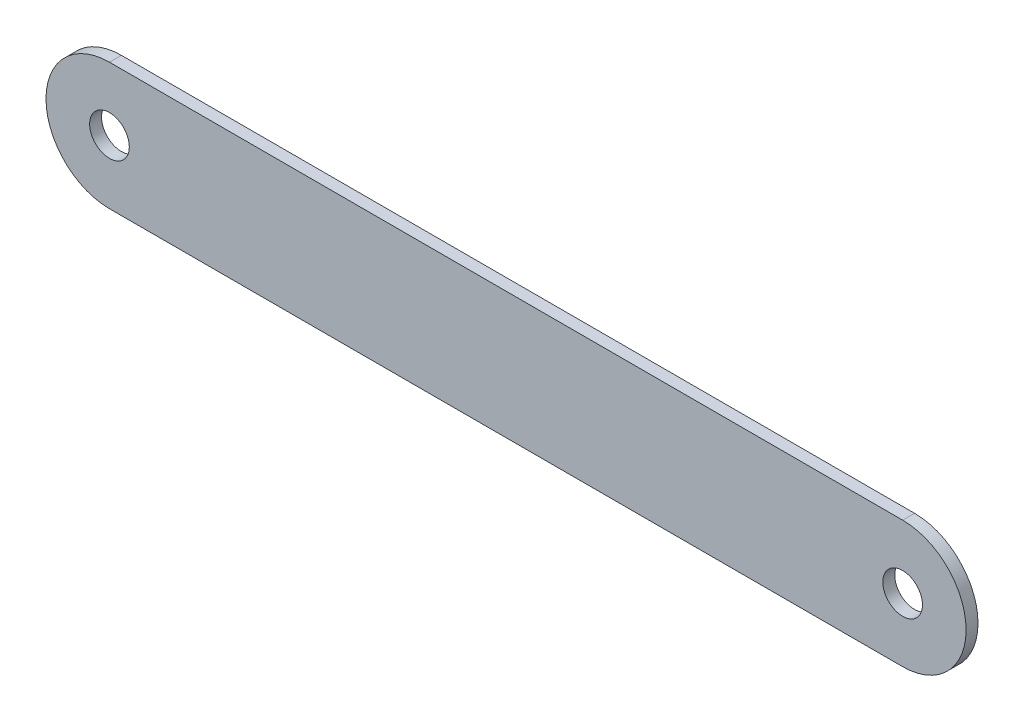
ISO-10303-21;
HEADER;
FILE_DESCRIPTION(('STEP AP214'),'2;1');
FILE_NAME('part.step','',(''),(''),'','','');
FILE_SCHEMA(('AUTOMOTIVE_DESIGN { 1 0 10303 214 1 1 1 1 }'));
ENDSEC;
DATA;
#1=APPLICATION_CONTEXT('core data for automotive mechanical design processes');
#2=APPLICATION_PROTOCOL_DEFINITION('international standard','automotive_design',2000,#1);
#3=PRODUCT_CONTEXT('',#1,'mechanical');
#4=PRODUCT('Part','Part','',(#3));
#5=PRODUCT_RELATED_PRODUCT_CATEGORY('part','',(#4));
#6=PRODUCT_DEFINITION_FORMATION('','',#4);
#7=PRODUCT_DEFINITION_CONTEXT('part definition',#1,'design');
#8=PRODUCT_DEFINITION('design','',#6,#7);
#9=PRODUCT_DEFINITION_SHAPE('','',#8);
#10=(LENGTH_UNIT() NAMED_UNIT(*) SI_UNIT(.MILLI.,.METRE.));
#11=(NAMED_UNIT(*) PLANE_ANGLE_UNIT() SI_UNIT($,.RADIAN.));
#12=(NAMED_UNIT(*) SI_UNIT($,.STERADIAN.) SOLID_ANGLE_UNIT());
#13=UNCERTAINTY_MEASURE_WITH_UNIT(LENGTH_MEASURE(1.E-05),#10,'distance_accuracy_value','');
#14=(GEOMETRIC_REPRESENTATION_CONTEXT(3) GLOBAL_UNCERTAINTY_ASSIGNED_CONTEXT((#13)) GLOBAL_UNIT_ASSIGNED_CONTEXT((#10,
#11,#12)) REPRESENTATION_CONTEXT('',''));
#15=CARTESIAN_POINT('',(0.,0.,0.));
#16=DIRECTION('',(0.,0.,1.));
#17=DIRECTION('',(1.,0.,0.));
#18=AXIS2_PLACEMENT_3D('',#15,#16,#17);
#19=CARTESIAN_POINT('',(0.,0.,3.));
#20=DIRECTION('',(0.,0.,-1.));
#21=DIRECTION('',(-1.,0.,0.));
#22=AXIS2_PLACEMENT_3D('',#19,#20,#21);
#23=CYLINDRICAL_SURFACE('',#22,16.);
#24=CARTESIAN_POINT('',(0.,0.,0.));
#25=DIRECTION('',(0.,0.,1.));
#26=DIRECTION('',(1.,0.,0.));
#27=AXIS2_PLACEMENT_3D('',#24,#25,#26);
#28=CIRCLE('',#27,16.);
#29=CARTESIAN_POINT('',(0.,-16.,0.));
#30=VERTEX_POINT('',#29);
#31=CARTESIAN_POINT('',(0.,16.,0.));
#32=VERTEX_POINT('',#31);
#33=EDGE_CURVE('E96',#30,#32,#28,.T.);
#34=ORIENTED_EDGE('',*,*,#33,.T.);
#35=DIRECTION('',(0.,0.,-1.));
#36=VECTOR('',#35,1.);
#37=CARTESIAN_POINT('',(0.,16.,3.));
#38=LINE('',#37,#36);
#39=CARTESIAN_POINT('',(0.,16.,3.));
#40=VERTEX_POINT('',#39);
#41=EDGE_CURVE('E11',#40,#32,#38,.T.);
#42=ORIENTED_EDGE('',*,*,#41,.F.);
#43=CARTESIAN_POINT('',(0.,0.,3.));
#44=DIRECTION('',(0.,0.,1.));
#45=DIRECTION('',(1.,0.,0.));
#46=AXIS2_PLACEMENT_3D('',#43,#44,#45);
#47=CIRCLE('',#46,16.);
#48=CARTESIAN_POINT('',(0.,-16.,3.));
#49=VERTEX_POINT('',#48);
#50=EDGE_CURVE('E84',#49,#40,#47,.T.);
#51=ORIENTED_EDGE('',*,*,#50,.F.);
#52=DIRECTION('',(0.,0.,-1.));
#53=VECTOR('',#52,1.);
#54=CARTESIAN_POINT('',(0.,-16.,3.));
#55=LINE('',#54,#53);
#56=EDGE_CURVE('E92',#49,#30,#55,.T.);
#57=ORIENTED_EDGE('',*,*,#56,.T.);
#58=EDGE_LOOP('',(#34,#42,#51,#57));
#59=FACE_BOUND('',#58,.T.);
#60=ADVANCED_FACE('F33',(#59),#23,.T.);
#61=CARTESIAN_POINT('',(0.,16.,3.));
#62=DIRECTION('',(0.,-1.,0.));
#63=DIRECTION('',(1.,0.,0.));
#64=AXIS2_PLACEMENT_3D('',#61,#62,#63);
#65=PLANE('',#64);
#66=DIRECTION('',(-1.,0.,0.));
#67=VECTOR('',#66,1.);
#68=CARTESIAN_POINT('',(0.,16.,0.));
#69=LINE('',#68,#67);
#70=CARTESIAN_POINT('',(-200.,16.,0.));
#71=VERTEX_POINT('',#70);
#72=EDGE_CURVE('E88',#32,#71,#69,.T.);
#73=ORIENTED_EDGE('',*,*,#72,.T.);
#74=DIRECTION('',(0.,0.,-1.));
#75=VECTOR('',#74,1.);
#76=CARTESIAN_POINT('',(-200.,16.,3.));
#77=LINE('',#76,#75);
#78=CARTESIAN_POINT('',(-200.,16.,3.));
#79=VERTEX_POINT('',#78);
#80=EDGE_CURVE('E41',#79,#71,#77,.T.);
#81=ORIENTED_EDGE('',*,*,#80,.F.);
#82=DIRECTION('',(-1.,0.,0.));
#83=VECTOR('',#82,1.);
#84=CARTESIAN_POINT('',(0.,16.,3.));
#85=LINE('',#84,#83);
#86=EDGE_CURVE('E79',#40,#79,#85,.T.);
#87=ORIENTED_EDGE('',*,*,#86,.F.);
#88=ORIENTED_EDGE('',*,*,#41,.T.);
#89=EDGE_LOOP('',(#73,#81,#87,#88));
#90=FACE_BOUND('',#89,.T.);
#91=ADVANCED_FACE('F87',(#90),#65,.F.);
#92=CARTESIAN_POINT('',(-200.,0.,3.));
#93=DIRECTION('',(0.,0.,-1.));
#94=DIRECTION('',(-1.,0.,0.));
#95=AXIS2_PLACEMENT_3D('',#92,#93,#94);
#96=CYLINDRICAL_SURFACE('',#95,16.);
#97=CARTESIAN_POINT('',(-200.,0.,0.));
#98=DIRECTION('',(0.,0.,1.));
#99=DIRECTION('',(1.,0.,0.));
#100=AXIS2_PLACEMENT_3D('',#97,#98,#99);
#101=CIRCLE('',#100,16.);
#102=CARTESIAN_POINT('',(-200.,-16.,0.));
#103=VERTEX_POINT('',#102);
#104=EDGE_CURVE('E66',#71,#103,#101,.T.);
#105=ORIENTED_EDGE('',*,*,#104,.T.);
#106=DIRECTION('',(0.,0.,-1.));
#107=VECTOR('',#106,1.);
#108=CARTESIAN_POINT('',(-200.,-16.,3.));
#109=LINE('',#108,#107);
#110=CARTESIAN_POINT('',(-200.,-16.,3.));
#111=VERTEX_POINT('',#110);
#112=EDGE_CURVE('E89',#111,#103,#109,.T.);
#113=ORIENTED_EDGE('',*,*,#112,.F.);
#114=CARTESIAN_POINT('',(-200.,0.,3.));
#115=DIRECTION('',(0.,0.,1.));
#116=DIRECTION('',(1.,0.,0.));
#117=AXIS2_PLACEMENT_3D('',#114,#115,#116);
#118=CIRCLE('',#117,16.);
#119=EDGE_CURVE('E82',#79,#111,#118,.T.);
#120=ORIENTED_EDGE('',*,*,#119,.F.);
#121=ORIENTED_EDGE('',*,*,#80,.T.);
#122=EDGE_LOOP('',(#105,#113,#120,#121));
#123=FACE_BOUND('',#122,.T.);
#124=ADVANCED_FACE('F90',(#123),#96,.T.);
#125=CARTESIAN_POINT('',(0.,-16.,3.));
#126=DIRECTION('',(0.,1.,0.));
#127=DIRECTION('',(-1.,0.,0.));
#128=AXIS2_PLACEMENT_3D('',#125,#126,#127);
#129=PLANE('',#128);
#130=DIRECTION('',(1.,0.,0.));
#131=VECTOR('',#130,1.);
#132=CARTESIAN_POINT('',(0.,-16.,0.));
#133=LINE('',#132,#131);
#134=EDGE_CURVE('E72',#103,#30,#133,.T.);
#135=ORIENTED_EDGE('',*,*,#134,.T.);
#136=ORIENTED_EDGE('',*,*,#56,.F.);
#137=DIRECTION('',(1.,0.,0.));
#138=VECTOR('',#137,1.);
#139=CARTESIAN_POINT('',(0.,-16.,3.));
#140=LINE('',#139,#138);
#141=EDGE_CURVE('E49',#111,#49,#140,.T.);
#142=ORIENTED_EDGE('',*,*,#141,.F.);
#143=ORIENTED_EDGE('',*,*,#112,.T.);
#144=EDGE_LOOP('',(#135,#136,#142,#143));
#145=FACE_BOUND('',#144,.T.);
#146=ADVANCED_FACE('F104',(#145),#129,.F.);
#147=CARTESIAN_POINT('',(0.,0.,3.));
#148=DIRECTION('',(0.,0.,1.));
#149=DIRECTION('',(1.,0.,0.));
#150=AXIS2_PLACEMENT_3D('',#147,#148,#149);
#151=PLANE('',#150);
#152=CARTESIAN_POINT('',(0.,0.,3.));
#153=DIRECTION('',(0.,0.,1.));
#154=DIRECTION('',(1.,0.,0.));
#155=AXIS2_PLACEMENT_3D('',#152,#153,#154);
#156=CIRCLE('',#155,5.);
#157=CARTESIAN_POINT('',(5.,0.,3.));
#158=VERTEX_POINT('',#157);
#159=EDGE_CURVE('E116',#158,#158,#156,.T.);
#160=ORIENTED_EDGE('',*,*,#159,.F.);
#161=EDGE_LOOP('',(#160));
#162=FACE_BOUND('',#161,.T.);
#163=CARTESIAN_POINT('',(-200.,0.,3.));
#164=DIRECTION('',(0.,0.,1.));
#165=DIRECTION('',(1.,0.,0.));
#166=AXIS2_PLACEMENT_3D('',#163,#164,#165);
#167=CIRCLE('',#166,4.99999999999999);
#168=CARTESIAN_POINT('',(-195.,0.,3.));
#169=VERTEX_POINT('',#168);
#170=EDGE_CURVE('E110',#169,#169,#167,.T.);
#171=ORIENTED_EDGE('',*,*,#170,.F.);
#172=EDGE_LOOP('',(#171));
#173=FACE_BOUND('',#172,.T.);
#174=ORIENTED_EDGE('',*,*,#50,.T.);
#175=ORIENTED_EDGE('',*,*,#86,.T.);
#176=ORIENTED_EDGE('',*,*,#119,.T.);
#177=ORIENTED_EDGE('',*,*,#141,.T.);
#178=EDGE_LOOP('',(#174,#175,#176,#177));
#179=FACE_BOUND('',#178,.T.);
#180=ADVANCED_FACE('F80',(#162,#173,#179),#151,.T.);
#181=CARTESIAN_POINT('',(0.,0.,0.));
#182=DIRECTION('',(0.,0.,1.));
#183=DIRECTION('',(1.,0.,0.));
#184=AXIS2_PLACEMENT_3D('',#181,#182,#183);
#185=PLANE('',#184);
#186=CARTESIAN_POINT('',(0.,0.,0.));
#187=DIRECTION('',(0.,0.,1.));
#188=DIRECTION('',(1.,0.,0.));
#189=AXIS2_PLACEMENT_3D('',#186,#187,#188);
#190=CIRCLE('',#189,5.);
#191=CARTESIAN_POINT('',(5.,0.,0.));
#192=VERTEX_POINT('',#191);
#193=EDGE_CURVE('E113',#192,#192,#190,.T.);
#194=ORIENTED_EDGE('',*,*,#193,.T.);
#195=EDGE_LOOP('',(#194));
#196=FACE_BOUND('',#195,.T.);
#197=CARTESIAN_POINT('',(-200.,0.,0.));
#198=DIRECTION('',(0.,0.,1.));
#199=DIRECTION('',(1.,0.,0.));
#200=AXIS2_PLACEMENT_3D('',#197,#198,#199);
#201=CIRCLE('',#200,4.99999999999999);
#202=CARTESIAN_POINT('',(-195.,0.,0.));
#203=VERTEX_POINT('',#202);
#204=EDGE_CURVE('E99',#203,#203,#201,.T.);
#205=ORIENTED_EDGE('',*,*,#204,.T.);
#206=EDGE_LOOP('',(#205));
#207=FACE_BOUND('',#206,.T.);
#208=ORIENTED_EDGE('',*,*,#33,.F.);
#209=ORIENTED_EDGE('',*,*,#134,.F.);
#210=ORIENTED_EDGE('',*,*,#104,.F.);
#211=ORIENTED_EDGE('',*,*,#72,.F.);
#212=EDGE_LOOP('',(#208,#209,#210,#211));
#213=FACE_BOUND('',#212,.T.);
#214=ADVANCED_FACE('F107',(#196,#207,#213),#185,.F.);
#215=CARTESIAN_POINT('',(-200.,0.,0.));
#216=DIRECTION('',(0.,0.,1.));
#217=DIRECTION('',(1.,0.,0.));
#218=AXIS2_PLACEMENT_3D('',#215,#216,#217);
#219=CYLINDRICAL_SURFACE('',#218,4.99999999999999);
#220=ORIENTED_EDGE('',*,*,#204,.F.);
#221=EDGE_LOOP('',(#220));
#222=FACE_BOUND('',#221,.T.);
#223=ORIENTED_EDGE('',*,*,#170,.T.);
#224=EDGE_LOOP('',(#223));
#225=FACE_BOUND('',#224,.T.);
#226=ADVANCED_FACE('F127',(#222,#225),#219,.F.);
#227=CARTESIAN_POINT('',(0.,0.,0.));
#228=DIRECTION('',(0.,0.,1.));
#229=DIRECTION('',(1.,0.,0.));
#230=AXIS2_PLACEMENT_3D('',#227,#228,#229);
#231=CYLINDRICAL_SURFACE('',#230,5.);
#232=ORIENTED_EDGE('',*,*,#193,.F.);
#233=EDGE_LOOP('',(#232));
#234=FACE_BOUND('',#233,.T.);
#235=ORIENTED_EDGE('',*,*,#159,.T.);
#236=EDGE_LOOP('',(#235));
#237=FACE_BOUND('',#236,.T.);
#238=ADVANCED_FACE('F124',(#234,#237),#231,.F.);
#239=CLOSED_SHELL('',(#60,#91,#124,#146,#180,#214,#226,#238));
#240=MANIFOLD_SOLID_BREP('B2',#239);
#241=ADVANCED_BREP_SHAPE_REPRESENTATION('',(#18,#240),#14);
#242=SHAPE_DEFINITION_REPRESENTATION(#9,#241);
ENDSEC;
END-ISO-10303-21;
